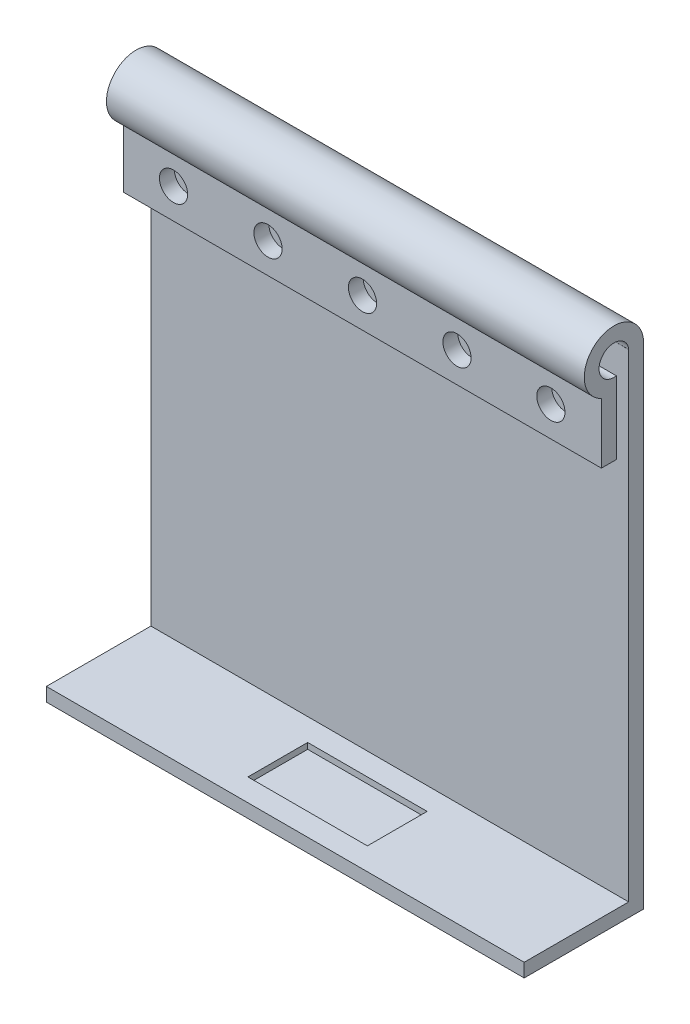
ISO-10303-21;
HEADER;
FILE_DESCRIPTION(('STEP AP214'),'2;1');
FILE_NAME('part.step','',(''),(''),'','','');
FILE_SCHEMA(('AUTOMOTIVE_DESIGN { 1 0 10303 214 1 1 1 1 }'));
ENDSEC;
DATA;
#1=APPLICATION_CONTEXT('core data for automotive mechanical design processes');
#2=APPLICATION_PROTOCOL_DEFINITION('international standard','automotive_design',2000,#1);
#3=PRODUCT_CONTEXT('',#1,'mechanical');
#4=PRODUCT('Part','Part','',(#3));
#5=PRODUCT_RELATED_PRODUCT_CATEGORY('part','',(#4));
#6=PRODUCT_DEFINITION_FORMATION('','',#4);
#7=PRODUCT_DEFINITION_CONTEXT('part definition',#1,'design');
#8=PRODUCT_DEFINITION('design','',#6,#7);
#9=PRODUCT_DEFINITION_SHAPE('','',#8);
#10=(LENGTH_UNIT() NAMED_UNIT(*) SI_UNIT(.MILLI.,.METRE.));
#11=(NAMED_UNIT(*) PLANE_ANGLE_UNIT() SI_UNIT($,.RADIAN.));
#12=(NAMED_UNIT(*) SI_UNIT($,.STERADIAN.) SOLID_ANGLE_UNIT());
#13=UNCERTAINTY_MEASURE_WITH_UNIT(LENGTH_MEASURE(1.E-05),#10,'distance_accuracy_value','');
#14=(GEOMETRIC_REPRESENTATION_CONTEXT(3) GLOBAL_UNCERTAINTY_ASSIGNED_CONTEXT((#13)) GLOBAL_UNIT_ASSIGNED_CONTEXT((#10,
#11,#12)) REPRESENTATION_CONTEXT('',''));
#15=CARTESIAN_POINT('',(0.,0.,0.));
#16=DIRECTION('',(0.,0.,1.));
#17=DIRECTION('',(1.,0.,0.));
#18=AXIS2_PLACEMENT_3D('',#15,#16,#17);
#19=CARTESIAN_POINT('',(0.,101.718969555035,3.175));
#20=DIRECTION('',(1.,0.,0.));
#21=DIRECTION('',(0.,0.,-1.));
#22=AXIS2_PLACEMENT_3D('',#19,#20,#21);
#23=PLANE('',#22);
#24=CARTESIAN_POINT('',(0.,101.334380732119,6.30719026611726));
#25=DIRECTION('',(1.,0.,0.));
#26=DIRECTION('',(0.,0.,-1.));
#27=AXIS2_PLACEMENT_3D('',#24,#25,#26);
#28=CIRCLE('',#27,3.175);
#29=CARTESIAN_POINT('',(0.,101.718969555035,3.15556902661396));
#30=VERTEX_POINT('',#29);
#31=CARTESIAN_POINT('',(0.,98.1999292876698,5.80138482685519));
#32=VERTEX_POINT('',#31);
#33=EDGE_CURVE('E304',#30,#32,#28,.T.);
#34=ORIENTED_EDGE('',*,*,#33,.T.);
#35=DIRECTION('',(0.,1.,0.));
#36=VECTOR('',#35,1.);
#37=CARTESIAN_POINT('',(0.,0.,5.80138482685519));
#38=LINE('',#37,#36);
#39=CARTESIAN_POINT('',(0.,82.7748742326806,5.80138482685519));
#40=VERTEX_POINT('',#39);
#41=EDGE_CURVE('E316',#40,#32,#38,.T.);
#42=ORIENTED_EDGE('',*,*,#41,.F.);
#43=DIRECTION('',(0.,0.,-1.));
#44=VECTOR('',#43,1.);
#45=CARTESIAN_POINT('',(0.,82.7748742326806,0.));
#46=LINE('',#45,#44);
#47=CARTESIAN_POINT('',(0.,82.7748742326806,8.97638482685518));
#48=VERTEX_POINT('',#47);
#49=EDGE_CURVE('E313',#48,#40,#46,.T.);
#50=ORIENTED_EDGE('',*,*,#49,.F.);
#51=DIRECTION('',(0.,-1.,0.));
#52=VECTOR('',#51,1.);
#53=CARTESIAN_POINT('',(0.,0.,8.97638482685518));
#54=LINE('',#53,#52);
#55=CARTESIAN_POINT('',(0.,95.6129273337618,8.97638482685518));
#56=VERTEX_POINT('',#55);
#57=EDGE_CURVE('E310',#56,#48,#54,.T.);
#58=ORIENTED_EDGE('',*,*,#57,.F.);
#59=CARTESIAN_POINT('',(0.,101.334380732119,6.30719026611726));
#60=DIRECTION('',(1.,0.,0.));
#61=DIRECTION('',(0.,0.,-1.));
#62=AXIS2_PLACEMENT_3D('',#59,#60,#61);
#63=CIRCLE('',#62,6.313448233149);
#64=CARTESIAN_POINT('',(0.,101.718969555035,0.00546668998822365));
#65=VERTEX_POINT('',#64);
#66=EDGE_CURVE('E307',#65,#56,#63,.T.);
#67=ORIENTED_EDGE('',*,*,#66,.F.);
#68=DIRECTION('',(0.,0.,-1.));
#69=VECTOR('',#68,1.);
#70=CARTESIAN_POINT('',(0.,101.718969555035,3.175));
#71=LINE('',#70,#69);
#72=CARTESIAN_POINT('',(0.,101.718969555035,0.));
#73=VERTEX_POINT('',#72);
#74=EDGE_CURVE('E386',#65,#73,#71,.T.);
#75=ORIENTED_EDGE('',*,*,#74,.T.);
#76=DIRECTION('',(0.,-1.,0.));
#77=VECTOR('',#76,1.);
#78=CARTESIAN_POINT('',(0.,101.718969555035,0.));
#79=LINE('',#78,#77);
#80=CARTESIAN_POINT('',(0.,101.615413718881,0.));
#81=VERTEX_POINT('',#80);
#82=EDGE_CURVE('E392',#73,#81,#79,.T.);
#83=ORIENTED_EDGE('',*,*,#82,.T.);
#84=CARTESIAN_POINT('',(0.,101.615413718881,0.));
#85=DIRECTION('',(0.,-1.,0.));
#86=VECTOR('',#85,1.);
#87=LINE('',#84,#86);
#88=CARTESIAN_POINT('',(0.,101.053347745358,0.));
#89=VERTEX_POINT('',#88);
#90=EDGE_CURVE('E396',#81,#89,#87,.T.);
#91=ORIENTED_EDGE('',*,*,#90,.T.);
#92=CARTESIAN_POINT('',(0.,-2.8971260585032,0.));
#93=VERTEX_POINT('',#92);
#94=EDGE_CURVE('E53',#89,#93,#79,.T.);
#95=ORIENTED_EDGE('',*,*,#94,.T.);
#96=DIRECTION('',(0.,0.,1.));
#97=VECTOR('',#96,1.);
#98=CARTESIAN_POINT('',(0.,-2.8971260585032,0.));
#99=LINE('',#98,#97);
#100=CARTESIAN_POINT('',(0.,-2.8971260585032,25.4));
#101=VERTEX_POINT('',#100);
#102=EDGE_CURVE('E229',#93,#101,#99,.T.);
#103=ORIENTED_EDGE('',*,*,#102,.T.);
#104=DIRECTION('',(0.,1.,0.));
#105=VECTOR('',#104,1.);
#106=CARTESIAN_POINT('',(0.,-2.8971260585032,25.4));
#107=LINE('',#106,#105);
#108=CARTESIAN_POINT('',(0.,0.,25.4));
#109=VERTEX_POINT('',#108);
#110=EDGE_CURVE('E220',#101,#109,#107,.T.);
#111=ORIENTED_EDGE('',*,*,#110,.T.);
#112=DIRECTION('',(0.,0.,-1.));
#113=VECTOR('',#112,1.);
#114=CARTESIAN_POINT('',(0.,0.,25.4));
#115=LINE('',#114,#113);
#116=CARTESIAN_POINT('',(0.,0.,3.175));
#117=VERTEX_POINT('',#116);
#118=EDGE_CURVE('E213',#109,#117,#115,.T.);
#119=ORIENTED_EDGE('',*,*,#118,.T.);
#120=DIRECTION('',(0.,-1.,0.));
#121=VECTOR('',#120,1.);
#122=CARTESIAN_POINT('',(0.,101.718969555035,3.175));
#123=LINE('',#122,#121);
#124=CARTESIAN_POINT('',(0.,101.718969555035,3.175));
#125=VERTEX_POINT('',#124);
#126=EDGE_CURVE('E371',#125,#117,#123,.T.);
#127=ORIENTED_EDGE('',*,*,#126,.F.);
#128=EDGE_CURVE('E461',#125,#30,#71,.T.);
#129=ORIENTED_EDGE('',*,*,#128,.T.);
#130=EDGE_LOOP('',(#34,#42,#50,#58,#67,#75,#83,#91,#95,#103,#111,#119,#127,#129));
#131=FACE_BOUND('',#130,.T.);
#132=ADVANCED_FACE('F49',(#131),#23,.F.);
#133=CARTESIAN_POINT('',(101.6,0.,3.175));
#134=DIRECTION('',(-1.,0.,0.));
#135=DIRECTION('',(0.,0.,1.));
#136=AXIS2_PLACEMENT_3D('',#133,#134,#135);
#137=PLANE('',#136);
#138=DIRECTION('',(0.,1.,0.));
#139=VECTOR('',#138,1.);
#140=CARTESIAN_POINT('',(101.6,0.,5.80138482685519));
#141=LINE('',#140,#139);
#142=CARTESIAN_POINT('',(101.6,82.7748742326806,5.80138482685519));
#143=VERTEX_POINT('',#142);
#144=CARTESIAN_POINT('',(101.6,98.1999292876698,5.80138482685519));
#145=VERTEX_POINT('',#144);
#146=EDGE_CURVE('E308',#143,#145,#141,.T.);
#147=ORIENTED_EDGE('',*,*,#146,.T.);
#148=CARTESIAN_POINT('',(101.6,101.334380732119,6.30719026611726));
#149=DIRECTION('',(1.,0.,0.));
#150=DIRECTION('',(0.,0.,-1.));
#151=AXIS2_PLACEMENT_3D('',#148,#149,#150);
#152=CIRCLE('',#151,3.175);
#153=CARTESIAN_POINT('',(101.6,101.718969555035,3.15556902661396));
#154=VERTEX_POINT('',#153);
#155=EDGE_CURVE('E303',#154,#145,#152,.T.);
#156=ORIENTED_EDGE('',*,*,#155,.F.);
#157=DIRECTION('',(0.,0.,-1.));
#158=VECTOR('',#157,1.);
#159=CARTESIAN_POINT('',(101.6,101.718969555035,3.175));
#160=LINE('',#159,#158);
#161=CARTESIAN_POINT('',(101.6,101.718969555035,3.175));
#162=VERTEX_POINT('',#161);
#163=EDGE_CURVE('E75',#162,#154,#160,.T.);
#164=ORIENTED_EDGE('',*,*,#163,.F.);
#165=DIRECTION('',(0.,1.,0.));
#166=VECTOR('',#165,1.);
#167=CARTESIAN_POINT('',(101.6,0.,3.175));
#168=LINE('',#167,#166);
#169=CARTESIAN_POINT('',(101.6,0.,3.175));
#170=VERTEX_POINT('',#169);
#171=EDGE_CURVE('E383',#170,#162,#168,.T.);
#172=ORIENTED_EDGE('',*,*,#171,.F.);
#173=DIRECTION('',(0.,0.,-1.));
#174=VECTOR('',#173,1.);
#175=CARTESIAN_POINT('',(101.6,0.,25.4));
#176=LINE('',#175,#174);
#177=CARTESIAN_POINT('',(101.6,0.,25.4));
#178=VERTEX_POINT('',#177);
#179=EDGE_CURVE('E217',#178,#170,#176,.T.);
#180=ORIENTED_EDGE('',*,*,#179,.F.);
#181=DIRECTION('',(0.,1.,0.));
#182=VECTOR('',#181,1.);
#183=CARTESIAN_POINT('',(101.6,-2.8971260585032,25.4));
#184=LINE('',#183,#182);
#185=CARTESIAN_POINT('',(101.6,-2.8971260585032,25.4));
#186=VERTEX_POINT('',#185);
#187=EDGE_CURVE('E223',#186,#178,#184,.T.);
#188=ORIENTED_EDGE('',*,*,#187,.F.);
#189=DIRECTION('',(0.,0.,1.));
#190=VECTOR('',#189,1.);
#191=CARTESIAN_POINT('',(101.6,-2.8971260585032,0.));
#192=LINE('',#191,#190);
#193=CARTESIAN_POINT('',(101.6,-2.8971260585032,0.));
#194=VERTEX_POINT('',#193);
#195=EDGE_CURVE('E219',#194,#186,#192,.T.);
#196=ORIENTED_EDGE('',*,*,#195,.F.);
#197=DIRECTION('',(0.,1.,0.));
#198=VECTOR('',#197,1.);
#199=CARTESIAN_POINT('',(101.6,0.,0.));
#200=LINE('',#199,#198);
#201=CARTESIAN_POINT('',(101.6,101.053347745358,0.));
#202=VERTEX_POINT('',#201);
#203=EDGE_CURVE('E413',#194,#202,#200,.T.);
#204=ORIENTED_EDGE('',*,*,#203,.T.);
#205=CARTESIAN_POINT('',(101.6,101.053347745358,0.));
#206=DIRECTION('',(0.,1.,0.));
#207=VECTOR('',#206,1.);
#208=LINE('',#205,#207);
#209=CARTESIAN_POINT('',(101.6,101.615413718881,0.));
#210=VERTEX_POINT('',#209);
#211=EDGE_CURVE('E344',#202,#210,#208,.T.);
#212=ORIENTED_EDGE('',*,*,#211,.T.);
#213=CARTESIAN_POINT('',(101.6,101.718969555035,0.));
#214=VERTEX_POINT('',#213);
#215=EDGE_CURVE('E395',#210,#214,#200,.T.);
#216=ORIENTED_EDGE('',*,*,#215,.T.);
#217=CARTESIAN_POINT('',(101.6,101.718969555035,0.00546668998822365));
#218=VERTEX_POINT('',#217);
#219=EDGE_CURVE('E480',#218,#214,#160,.T.);
#220=ORIENTED_EDGE('',*,*,#219,.F.);
#221=CARTESIAN_POINT('',(101.6,101.334380732119,6.30719026611726));
#222=DIRECTION('',(1.,0.,0.));
#223=DIRECTION('',(0.,0.,-1.));
#224=AXIS2_PLACEMENT_3D('',#221,#222,#223);
#225=CIRCLE('',#224,6.313448233149);
#226=CARTESIAN_POINT('',(101.6,95.6129273337618,8.97638482685518));
#227=VERTEX_POINT('',#226);
#228=EDGE_CURVE('E321',#218,#227,#225,.T.);
#229=ORIENTED_EDGE('',*,*,#228,.T.);
#230=DIRECTION('',(0.,-1.,0.));
#231=VECTOR('',#230,1.);
#232=CARTESIAN_POINT('',(101.6,0.,8.97638482685518));
#233=LINE('',#232,#231);
#234=CARTESIAN_POINT('',(101.6,82.7748742326806,8.97638482685518));
#235=VERTEX_POINT('',#234);
#236=EDGE_CURVE('E323',#227,#235,#233,.T.);
#237=ORIENTED_EDGE('',*,*,#236,.T.);
#238=DIRECTION('',(0.,0.,-1.));
#239=VECTOR('',#238,1.);
#240=CARTESIAN_POINT('',(101.6,82.7748742326806,0.));
#241=LINE('',#240,#239);
#242=EDGE_CURVE('E326',#235,#143,#241,.T.);
#243=ORIENTED_EDGE('',*,*,#242,.T.);
#244=EDGE_LOOP('',(#147,#156,#164,#172,#180,#188,#196,#204,#212,#216,#220,#229,#237,#243));
#245=FACE_BOUND('',#244,.T.);
#246=ADVANCED_FACE('F423',(#245),#137,.F.);
#247=CARTESIAN_POINT('',(0.,101.334380732119,6.30719026611726));
#248=DIRECTION('',(1.,0.,0.));
#249=DIRECTION('',(0.,0.,-1.));
#250=AXIS2_PLACEMENT_3D('',#247,#248,#249);
#251=CYLINDRICAL_SURFACE('',#250,3.175);
#252=DIRECTION('',(1.,0.,0.));
#253=VECTOR('',#252,1.);
#254=CARTESIAN_POINT('',(0.,98.1999292876698,5.80138482685519));
#255=LINE('',#254,#253);
#256=EDGE_CURVE('E300',#32,#145,#255,.T.);
#257=ORIENTED_EDGE('',*,*,#256,.F.);
#258=ORIENTED_EDGE('',*,*,#33,.F.);
#259=DIRECTION('',(1.,0.,0.));
#260=VECTOR('',#259,1.);
#261=CARTESIAN_POINT('',(0.,101.718969555035,3.15556902661396));
#262=LINE('',#261,#260);
#263=EDGE_CURVE('E339',#30,#154,#262,.T.);
#264=ORIENTED_EDGE('',*,*,#263,.T.);
#265=ORIENTED_EDGE('',*,*,#155,.T.);
#266=EDGE_LOOP('',(#257,#258,#264,#265));
#267=FACE_BOUND('',#266,.T.);
#268=ADVANCED_FACE('F365',(#267),#251,.F.);
#269=CARTESIAN_POINT('',(101.6,101.718969555035,3.175));
#270=DIRECTION('',(0.,-1.,0.));
#271=DIRECTION('',(0.,0.,-1.));
#272=AXIS2_PLACEMENT_3D('',#269,#270,#271);
#273=PLANE('',#272);
#274=ORIENTED_EDGE('',*,*,#263,.F.);
#275=ORIENTED_EDGE('',*,*,#128,.F.);
#276=DIRECTION('',(-1.,0.,0.));
#277=VECTOR('',#276,1.);
#278=CARTESIAN_POINT('',(101.6,101.718969555035,3.175));
#279=LINE('',#278,#277);
#280=EDGE_CURVE('E385',#162,#125,#279,.T.);
#281=ORIENTED_EDGE('',*,*,#280,.F.);
#282=ORIENTED_EDGE('',*,*,#163,.T.);
#283=EDGE_LOOP('',(#274,#275,#281,#282));
#284=FACE_BOUND('',#283,.T.);
#285=ADVANCED_FACE('F439',(#284),#273,.F.);
#286=CARTESIAN_POINT('',(0.,0.,0.));
#287=DIRECTION('',(0.,0.,1.));
#288=DIRECTION('',(1.,0.,0.));
#289=AXIS2_PLACEMENT_3D('',#286,#287,#288);
#290=PLANE('',#289);
#291=CARTESIAN_POINT('',(10.6180528519266,89.1939007832212,0.));
#292=DIRECTION('',(0.,0.,1.));
#293=DIRECTION('',(1.,0.,0.));
#294=AXIS2_PLACEMENT_3D('',#291,#292,#293);
#295=CIRCLE('',#294,3.);
#296=CARTESIAN_POINT('',(13.6180528519266,89.1939007832212,0.));
#297=VERTEX_POINT('',#296);
#298=EDGE_CURVE('E297',#297,#297,#295,.T.);
#299=ORIENTED_EDGE('',*,*,#298,.T.);
#300=EDGE_LOOP('',(#299));
#301=FACE_BOUND('',#300,.T.);
#302=CARTESIAN_POINT('',(50.8,89.1939007832212,0.));
#303=DIRECTION('',(0.,0.,1.));
#304=DIRECTION('',(1.,0.,0.));
#305=AXIS2_PLACEMENT_3D('',#302,#303,#304);
#306=CIRCLE('',#305,3.);
#307=CARTESIAN_POINT('',(53.8,89.1939007832212,0.));
#308=VERTEX_POINT('',#307);
#309=EDGE_CURVE('E288',#308,#308,#306,.T.);
#310=ORIENTED_EDGE('',*,*,#309,.T.);
#311=EDGE_LOOP('',(#310));
#312=FACE_BOUND('',#311,.T.);
#313=CARTESIAN_POINT('',(90.8563696876377,89.1939007832212,0.));
#314=DIRECTION('',(0.,0.,1.));
#315=DIRECTION('',(1.,0.,0.));
#316=AXIS2_PLACEMENT_3D('',#313,#314,#315);
#317=CIRCLE('',#316,3.00000000000001);
#318=CARTESIAN_POINT('',(93.8563696876377,89.1939007832212,0.));
#319=VERTEX_POINT('',#318);
#320=EDGE_CURVE('E279',#319,#319,#317,.T.);
#321=ORIENTED_EDGE('',*,*,#320,.T.);
#322=EDGE_LOOP('',(#321));
#323=FACE_BOUND('',#322,.T.);
#324=CARTESIAN_POINT('',(70.8909735740367,89.1939007832212,0.));
#325=DIRECTION('',(0.,0.,1.));
#326=DIRECTION('',(1.,0.,0.));
#327=AXIS2_PLACEMENT_3D('',#324,#325,#326);
#328=CIRCLE('',#327,3.00000000000001);
#329=CARTESIAN_POINT('',(73.8909735740367,89.1939007832212,0.));
#330=VERTEX_POINT('',#329);
#331=EDGE_CURVE('E270',#330,#330,#328,.T.);
#332=ORIENTED_EDGE('',*,*,#331,.T.);
#333=EDGE_LOOP('',(#332));
#334=FACE_BOUND('',#333,.T.);
#335=CARTESIAN_POINT('',(30.7090264259633,89.1939007832212,0.));
#336=DIRECTION('',(0.,0.,1.));
#337=DIRECTION('',(1.,0.,0.));
#338=AXIS2_PLACEMENT_3D('',#335,#336,#337);
#339=CIRCLE('',#338,3.);
#340=CARTESIAN_POINT('',(33.7090264259633,89.1939007832212,0.));
#341=VERTEX_POINT('',#340);
#342=EDGE_CURVE('E261',#341,#341,#339,.T.);
#343=ORIENTED_EDGE('',*,*,#342,.T.);
#344=EDGE_LOOP('',(#343));
#345=FACE_BOUND('',#344,.T.);
#346=ORIENTED_EDGE('',*,*,#94,.F.);
#347=DIRECTION('',(1.,0.,0.));
#348=VECTOR('',#347,1.);
#349=CARTESIAN_POINT('',(0.,101.053347745358,0.));
#350=LINE('',#349,#348);
#351=EDGE_CURVE('E11',#89,#202,#350,.T.);
#352=ORIENTED_EDGE('',*,*,#351,.T.);
#353=ORIENTED_EDGE('',*,*,#203,.F.);
#354=DIRECTION('',(-1.,0.,0.));
#355=VECTOR('',#354,1.);
#356=CARTESIAN_POINT('',(101.6,-2.8971260585032,0.));
#357=LINE('',#356,#355);
#358=EDGE_CURVE('E226',#194,#93,#357,.T.);
#359=ORIENTED_EDGE('',*,*,#358,.T.);
#360=EDGE_LOOP('',(#346,#352,#353,#359));
#361=FACE_BOUND('',#360,.T.);
#362=ADVANCED_FACE('F437',(#301,#312,#323,#334,#345,#361),#290,.F.);
#363=ORIENTED_EDGE('',*,*,#74,.F.);
#364=DIRECTION('',(1.,0.,0.));
#365=VECTOR('',#364,1.);
#366=CARTESIAN_POINT('',(0.,101.718969555035,0.00546668998822365));
#367=LINE('',#366,#365);
#368=EDGE_CURVE('E332',#65,#218,#367,.T.);
#369=ORIENTED_EDGE('',*,*,#368,.T.);
#370=ORIENTED_EDGE('',*,*,#219,.T.);
#371=DIRECTION('',(-1.,0.,0.));
#372=VECTOR('',#371,1.);
#373=CARTESIAN_POINT('',(101.6,101.718969555035,0.));
#374=LINE('',#373,#372);
#375=EDGE_CURVE('E380',#214,#73,#374,.T.);
#376=ORIENTED_EDGE('',*,*,#375,.T.);
#377=EDGE_LOOP('',(#363,#369,#370,#376));
#378=FACE_BOUND('',#377,.T.);
#379=ADVANCED_FACE('F433',(#378),#273,.F.);
#380=CARTESIAN_POINT('',(0.,0.,3.175));
#381=DIRECTION('',(0.,0.,1.));
#382=DIRECTION('',(1.,0.,0.));
#383=AXIS2_PLACEMENT_3D('',#380,#381,#382);
#384=PLANE('',#383);
#385=CARTESIAN_POINT('',(10.6180528519266,89.1939007832212,3.175));
#386=DIRECTION('',(0.,0.,1.));
#387=DIRECTION('',(1.,0.,0.));
#388=AXIS2_PLACEMENT_3D('',#385,#386,#387);
#389=CIRCLE('',#388,3.);
#390=CARTESIAN_POINT('',(13.6180528519266,89.1939007832212,3.175));
#391=VERTEX_POINT('',#390);
#392=EDGE_CURVE('E294',#391,#391,#389,.T.);
#393=ORIENTED_EDGE('',*,*,#392,.F.);
#394=EDGE_LOOP('',(#393));
#395=FACE_BOUND('',#394,.T.);
#396=CARTESIAN_POINT('',(50.8,89.1939007832212,3.175));
#397=DIRECTION('',(0.,0.,1.));
#398=DIRECTION('',(1.,0.,0.));
#399=AXIS2_PLACEMENT_3D('',#396,#397,#398);
#400=CIRCLE('',#399,3.);
#401=CARTESIAN_POINT('',(53.8,89.1939007832212,3.175));
#402=VERTEX_POINT('',#401);
#403=EDGE_CURVE('E285',#402,#402,#400,.T.);
#404=ORIENTED_EDGE('',*,*,#403,.F.);
#405=EDGE_LOOP('',(#404));
#406=FACE_BOUND('',#405,.T.);
#407=CARTESIAN_POINT('',(90.8563696876377,89.1939007832212,3.175));
#408=DIRECTION('',(0.,0.,1.));
#409=DIRECTION('',(1.,0.,0.));
#410=AXIS2_PLACEMENT_3D('',#407,#408,#409);
#411=CIRCLE('',#410,3.00000000000001);
#412=CARTESIAN_POINT('',(93.8563696876377,89.1939007832212,3.175));
#413=VERTEX_POINT('',#412);
#414=EDGE_CURVE('E276',#413,#413,#411,.T.);
#415=ORIENTED_EDGE('',*,*,#414,.F.);
#416=EDGE_LOOP('',(#415));
#417=FACE_BOUND('',#416,.T.);
#418=CARTESIAN_POINT('',(70.8909735740367,89.1939007832212,3.175));
#419=DIRECTION('',(0.,0.,1.));
#420=DIRECTION('',(1.,0.,0.));
#421=AXIS2_PLACEMENT_3D('',#418,#419,#420);
#422=CIRCLE('',#421,3.00000000000001);
#423=CARTESIAN_POINT('',(73.8909735740367,89.1939007832212,3.175));
#424=VERTEX_POINT('',#423);
#425=EDGE_CURVE('E267',#424,#424,#422,.T.);
#426=ORIENTED_EDGE('',*,*,#425,.F.);
#427=EDGE_LOOP('',(#426));
#428=FACE_BOUND('',#427,.T.);
#429=CARTESIAN_POINT('',(30.7090264259633,89.1939007832212,3.175));
#430=DIRECTION('',(0.,0.,1.));
#431=DIRECTION('',(1.,0.,0.));
#432=AXIS2_PLACEMENT_3D('',#429,#430,#431);
#433=CIRCLE('',#432,3.);
#434=CARTESIAN_POINT('',(33.7090264259633,89.1939007832212,3.175));
#435=VERTEX_POINT('',#434);
#436=EDGE_CURVE('E258',#435,#435,#433,.T.);
#437=ORIENTED_EDGE('',*,*,#436,.F.);
#438=EDGE_LOOP('',(#437));
#439=FACE_BOUND('',#438,.T.);
#440=ORIENTED_EDGE('',*,*,#171,.T.);
#441=ORIENTED_EDGE('',*,*,#280,.T.);
#442=ORIENTED_EDGE('',*,*,#126,.T.);
#443=DIRECTION('',(1.,0.,0.));
#444=VECTOR('',#443,1.);
#445=CARTESIAN_POINT('',(0.,0.,3.175));
#446=LINE('',#445,#444);
#447=EDGE_CURVE('E379',#117,#170,#446,.T.);
#448=ORIENTED_EDGE('',*,*,#447,.T.);
#449=EDGE_LOOP('',(#440,#441,#442,#448));
#450=FACE_BOUND('',#449,.T.);
#451=ADVANCED_FACE('F436',(#395,#406,#417,#428,#439,#450),#384,.T.);
#452=ORIENTED_EDGE('',*,*,#215,.F.);
#453=DIRECTION('',(1.,0.,0.));
#454=VECTOR('',#453,1.);
#455=CARTESIAN_POINT('',(0.,101.615413718881,0.));
#456=LINE('',#455,#454);
#457=EDGE_CURVE('E59',#210,#81,#456,.F.);
#458=ORIENTED_EDGE('',*,*,#457,.T.);
#459=ORIENTED_EDGE('',*,*,#82,.F.);
#460=ORIENTED_EDGE('',*,*,#375,.F.);
#461=EDGE_LOOP('',(#452,#458,#459,#460));
#462=FACE_BOUND('',#461,.T.);
#463=ADVANCED_FACE('F440',(#462),#290,.F.);
#464=CARTESIAN_POINT('',(0.,101.334380732119,6.30719026611726));
#465=DIRECTION('',(1.,0.,0.));
#466=DIRECTION('',(0.,0.,-1.));
#467=AXIS2_PLACEMENT_3D('',#464,#465,#466);
#468=CYLINDRICAL_SURFACE('',#467,6.313448233149);
#469=ORIENTED_EDGE('',*,*,#351,.F.);
#470=ORIENTED_EDGE('',*,*,#90,.F.);
#471=ORIENTED_EDGE('',*,*,#457,.F.);
#472=ORIENTED_EDGE('',*,*,#211,.F.);
#473=EDGE_LOOP('',(#469,#470,#471,#472));
#474=FACE_BOUND('',#473,.T.);
#475=ADVANCED_FACE('F361',(#474),#468,.T.);
#476=ORIENTED_EDGE('',*,*,#368,.F.);
#477=ORIENTED_EDGE('',*,*,#66,.T.);
#478=DIRECTION('',(1.,0.,0.));
#479=VECTOR('',#478,1.);
#480=CARTESIAN_POINT('',(0.,95.6129273337618,8.97638482685518));
#481=LINE('',#480,#479);
#482=EDGE_CURVE('E318',#56,#227,#481,.T.);
#483=ORIENTED_EDGE('',*,*,#482,.T.);
#484=ORIENTED_EDGE('',*,*,#228,.F.);
#485=EDGE_LOOP('',(#476,#477,#483,#484));
#486=FACE_BOUND('',#485,.T.);
#487=ADVANCED_FACE('F350',(#486),#468,.T.);
#488=CARTESIAN_POINT('',(0.,0.,5.80138482685519));
#489=DIRECTION('',(0.,0.,-1.));
#490=DIRECTION('',(-1.,0.,0.));
#491=AXIS2_PLACEMENT_3D('',#488,#489,#490);
#492=PLANE('',#491);
#493=CARTESIAN_POINT('',(10.6180528519266,89.1939007832212,5.80138482685519));
#494=DIRECTION('',(0.,0.,-1.));
#495=DIRECTION('',(-1.,0.,0.));
#496=AXIS2_PLACEMENT_3D('',#493,#494,#495);
#497=CIRCLE('',#496,3.);
#498=CARTESIAN_POINT('',(7.61805285192657,89.1939007832212,5.80138482685519));
#499=VERTEX_POINT('',#498);
#500=EDGE_CURVE('E291',#499,#499,#497,.T.);
#501=ORIENTED_EDGE('',*,*,#500,.F.);
#502=EDGE_LOOP('',(#501));
#503=FACE_BOUND('',#502,.T.);
#504=CARTESIAN_POINT('',(50.8,89.1939007832212,5.80138482685519));
#505=DIRECTION('',(0.,0.,-1.));
#506=DIRECTION('',(-1.,0.,0.));
#507=AXIS2_PLACEMENT_3D('',#504,#505,#506);
#508=CIRCLE('',#507,3.);
#509=CARTESIAN_POINT('',(47.8,89.1939007832212,5.80138482685519));
#510=VERTEX_POINT('',#509);
#511=EDGE_CURVE('E282',#510,#510,#508,.T.);
#512=ORIENTED_EDGE('',*,*,#511,.F.);
#513=EDGE_LOOP('',(#512));
#514=FACE_BOUND('',#513,.T.);
#515=CARTESIAN_POINT('',(90.8563696876377,89.1939007832212,5.80138482685519));
#516=DIRECTION('',(0.,0.,-1.));
#517=DIRECTION('',(-1.,0.,0.));
#518=AXIS2_PLACEMENT_3D('',#515,#516,#517);
#519=CIRCLE('',#518,3.00000000000001);
#520=CARTESIAN_POINT('',(87.8563696876377,89.1939007832212,5.80138482685519));
#521=VERTEX_POINT('',#520);
#522=EDGE_CURVE('E273',#521,#521,#519,.T.);
#523=ORIENTED_EDGE('',*,*,#522,.F.);
#524=EDGE_LOOP('',(#523));
#525=FACE_BOUND('',#524,.T.);
#526=CARTESIAN_POINT('',(70.8909735740367,89.1939007832212,5.80138482685519));
#527=DIRECTION('',(0.,0.,-1.));
#528=DIRECTION('',(-1.,0.,0.));
#529=AXIS2_PLACEMENT_3D('',#526,#527,#528);
#530=CIRCLE('',#529,3.00000000000001);
#531=CARTESIAN_POINT('',(67.8909735740367,89.1939007832212,5.80138482685519));
#532=VERTEX_POINT('',#531);
#533=EDGE_CURVE('E264',#532,#532,#530,.T.);
#534=ORIENTED_EDGE('',*,*,#533,.F.);
#535=EDGE_LOOP('',(#534));
#536=FACE_BOUND('',#535,.T.);
#537=CARTESIAN_POINT('',(30.7090264259633,89.1939007832212,5.80138482685519));
#538=DIRECTION('',(0.,0.,-1.));
#539=DIRECTION('',(-1.,0.,0.));
#540=AXIS2_PLACEMENT_3D('',#537,#538,#539);
#541=CIRCLE('',#540,3.);
#542=CARTESIAN_POINT('',(27.7090264259633,89.1939007832212,5.80138482685519));
#543=VERTEX_POINT('',#542);
#544=EDGE_CURVE('E244',#543,#543,#541,.T.);
#545=ORIENTED_EDGE('',*,*,#544,.F.);
#546=EDGE_LOOP('',(#545));
#547=FACE_BOUND('',#546,.T.);
#548=ORIENTED_EDGE('',*,*,#146,.F.);
#549=DIRECTION('',(1.,0.,0.));
#550=VECTOR('',#549,1.);
#551=CARTESIAN_POINT('',(0.,82.7748742326806,5.80138482685519));
#552=LINE('',#551,#550);
#553=EDGE_CURVE('E330',#40,#143,#552,.T.);
#554=ORIENTED_EDGE('',*,*,#553,.F.);
#555=ORIENTED_EDGE('',*,*,#41,.T.);
#556=ORIENTED_EDGE('',*,*,#256,.T.);
#557=EDGE_LOOP('',(#548,#554,#555,#556));
#558=FACE_BOUND('',#557,.T.);
#559=ADVANCED_FACE('F360',(#503,#514,#525,#536,#547,#558),#492,.T.);
#560=CARTESIAN_POINT('',(0.,82.7748742326806,0.));
#561=DIRECTION('',(0.,-1.,0.));
#562=DIRECTION('',(0.,0.,-1.));
#563=AXIS2_PLACEMENT_3D('',#560,#561,#562);
#564=PLANE('',#563);
#565=ORIENTED_EDGE('',*,*,#242,.F.);
#566=DIRECTION('',(1.,0.,0.));
#567=VECTOR('',#566,1.);
#568=CARTESIAN_POINT('',(0.,82.7748742326806,8.97638482685518));
#569=LINE('',#568,#567);
#570=EDGE_CURVE('E333',#48,#235,#569,.T.);
#571=ORIENTED_EDGE('',*,*,#570,.F.);
#572=ORIENTED_EDGE('',*,*,#49,.T.);
#573=ORIENTED_EDGE('',*,*,#553,.T.);
#574=EDGE_LOOP('',(#565,#571,#572,#573));
#575=FACE_BOUND('',#574,.T.);
#576=ADVANCED_FACE('F469',(#575),#564,.T.);
#577=CARTESIAN_POINT('',(0.,0.,8.97638482685518));
#578=DIRECTION('',(0.,0.,1.));
#579=DIRECTION('',(1.,0.,0.));
#580=AXIS2_PLACEMENT_3D('',#577,#578,#579);
#581=PLANE('',#580);
#582=CARTESIAN_POINT('',(10.6180528519266,89.1939007832212,8.97638482685518));
#583=DIRECTION('',(0.,0.,1.));
#584=DIRECTION('',(1.,0.,0.));
#585=AXIS2_PLACEMENT_3D('',#582,#583,#584);
#586=CIRCLE('',#585,3.);
#587=CARTESIAN_POINT('',(13.6180528519266,89.1939007832212,8.97638482685518));
#588=VERTEX_POINT('',#587);
#589=EDGE_CURVE('E241',#588,#588,#586,.T.);
#590=ORIENTED_EDGE('',*,*,#589,.F.);
#591=EDGE_LOOP('',(#590));
#592=FACE_BOUND('',#591,.T.);
#593=CARTESIAN_POINT('',(50.8,89.1939007832212,8.97638482685518));
#594=DIRECTION('',(0.,0.,1.));
#595=DIRECTION('',(1.,0.,0.));
#596=AXIS2_PLACEMENT_3D('',#593,#594,#595);
#597=CIRCLE('',#596,3.);
#598=CARTESIAN_POINT('',(53.8,89.1939007832212,8.97638482685518));
#599=VERTEX_POINT('',#598);
#600=EDGE_CURVE('E236',#599,#599,#597,.T.);
#601=ORIENTED_EDGE('',*,*,#600,.F.);
#602=EDGE_LOOP('',(#601));
#603=FACE_BOUND('',#602,.T.);
#604=CARTESIAN_POINT('',(90.8563696876377,89.1939007832212,8.97638482685518));
#605=DIRECTION('',(0.,0.,1.));
#606=DIRECTION('',(1.,0.,0.));
#607=AXIS2_PLACEMENT_3D('',#604,#605,#606);
#608=CIRCLE('',#607,3.00000000000001);
#609=CARTESIAN_POINT('',(93.8563696876377,89.1939007832212,8.97638482685518));
#610=VERTEX_POINT('',#609);
#611=EDGE_CURVE('E246',#610,#610,#608,.T.);
#612=ORIENTED_EDGE('',*,*,#611,.F.);
#613=EDGE_LOOP('',(#612));
#614=FACE_BOUND('',#613,.T.);
#615=CARTESIAN_POINT('',(70.8909735740367,89.1939007832212,8.97638482685518));
#616=DIRECTION('',(0.,0.,1.));
#617=DIRECTION('',(1.,0.,0.));
#618=AXIS2_PLACEMENT_3D('',#615,#616,#617);
#619=CIRCLE('',#618,3.00000000000001);
#620=CARTESIAN_POINT('',(73.8909735740367,89.1939007832212,8.97638482685518));
#621=VERTEX_POINT('',#620);
#622=EDGE_CURVE('E249',#621,#621,#619,.T.);
#623=ORIENTED_EDGE('',*,*,#622,.F.);
#624=EDGE_LOOP('',(#623));
#625=FACE_BOUND('',#624,.T.);
#626=CARTESIAN_POINT('',(30.7090264259633,89.1939007832212,8.97638482685518));
#627=DIRECTION('',(0.,0.,1.));
#628=DIRECTION('',(1.,0.,0.));
#629=AXIS2_PLACEMENT_3D('',#626,#627,#628);
#630=CIRCLE('',#629,3.);
#631=CARTESIAN_POINT('',(33.7090264259633,89.1939007832212,8.97638482685518));
#632=VERTEX_POINT('',#631);
#633=EDGE_CURVE('E245',#632,#632,#630,.T.);
#634=ORIENTED_EDGE('',*,*,#633,.F.);
#635=EDGE_LOOP('',(#634));
#636=FACE_BOUND('',#635,.T.);
#637=ORIENTED_EDGE('',*,*,#236,.F.);
#638=ORIENTED_EDGE('',*,*,#482,.F.);
#639=ORIENTED_EDGE('',*,*,#57,.T.);
#640=ORIENTED_EDGE('',*,*,#570,.T.);
#641=EDGE_LOOP('',(#637,#638,#639,#640));
#642=FACE_BOUND('',#641,.T.);
#643=ADVANCED_FACE('F363',(#592,#603,#614,#625,#636,#642),#581,.T.);
#644=CARTESIAN_POINT('',(30.7090264259633,89.1939007832212,-1.81861517314481));
#645=DIRECTION('',(0.,0.,1.));
#646=DIRECTION('',(1.,0.,0.));
#647=AXIS2_PLACEMENT_3D('',#644,#645,#646);
#648=CYLINDRICAL_SURFACE('',#647,3.);
#649=ORIENTED_EDGE('',*,*,#544,.T.);
#650=EDGE_LOOP('',(#649));
#651=FACE_BOUND('',#650,.T.);
#652=ORIENTED_EDGE('',*,*,#633,.T.);
#653=EDGE_LOOP('',(#652));
#654=FACE_BOUND('',#653,.T.);
#655=ADVANCED_FACE('F525',(#651,#654),#648,.F.);
#656=CARTESIAN_POINT('',(70.8909735740367,89.1939007832212,-1.81861517314481));
#657=DIRECTION('',(0.,0.,1.));
#658=DIRECTION('',(1.,0.,0.));
#659=AXIS2_PLACEMENT_3D('',#656,#657,#658);
#660=CYLINDRICAL_SURFACE('',#659,3.00000000000001);
#661=ORIENTED_EDGE('',*,*,#533,.T.);
#662=EDGE_LOOP('',(#661));
#663=FACE_BOUND('',#662,.T.);
#664=ORIENTED_EDGE('',*,*,#622,.T.);
#665=EDGE_LOOP('',(#664));
#666=FACE_BOUND('',#665,.T.);
#667=ADVANCED_FACE('F531',(#663,#666),#660,.F.);
#668=CARTESIAN_POINT('',(90.8563696876377,89.1939007832212,-1.81861517314481));
#669=DIRECTION('',(0.,0.,1.));
#670=DIRECTION('',(1.,0.,0.));
#671=AXIS2_PLACEMENT_3D('',#668,#669,#670);
#672=CYLINDRICAL_SURFACE('',#671,3.00000000000001);
#673=ORIENTED_EDGE('',*,*,#522,.T.);
#674=EDGE_LOOP('',(#673));
#675=FACE_BOUND('',#674,.T.);
#676=ORIENTED_EDGE('',*,*,#611,.T.);
#677=EDGE_LOOP('',(#676));
#678=FACE_BOUND('',#677,.T.);
#679=ADVANCED_FACE('F541',(#675,#678),#672,.F.);
#680=CARTESIAN_POINT('',(50.8,89.1939007832212,-1.81861517314481));
#681=DIRECTION('',(0.,0.,1.));
#682=DIRECTION('',(1.,0.,0.));
#683=AXIS2_PLACEMENT_3D('',#680,#681,#682);
#684=CYLINDRICAL_SURFACE('',#683,3.);
#685=ORIENTED_EDGE('',*,*,#511,.T.);
#686=EDGE_LOOP('',(#685));
#687=FACE_BOUND('',#686,.T.);
#688=ORIENTED_EDGE('',*,*,#600,.T.);
#689=EDGE_LOOP('',(#688));
#690=FACE_BOUND('',#689,.T.);
#691=ADVANCED_FACE('F551',(#687,#690),#684,.F.);
#692=CARTESIAN_POINT('',(10.6180528519266,89.1939007832212,-1.81861517314481));
#693=DIRECTION('',(0.,0.,1.));
#694=DIRECTION('',(1.,0.,0.));
#695=AXIS2_PLACEMENT_3D('',#692,#693,#694);
#696=CYLINDRICAL_SURFACE('',#695,3.);
#697=ORIENTED_EDGE('',*,*,#500,.T.);
#698=EDGE_LOOP('',(#697));
#699=FACE_BOUND('',#698,.T.);
#700=ORIENTED_EDGE('',*,*,#589,.T.);
#701=EDGE_LOOP('',(#700));
#702=FACE_BOUND('',#701,.T.);
#703=ADVANCED_FACE('F561',(#699,#702),#696,.F.);
#704=ORIENTED_EDGE('',*,*,#436,.T.);
#705=EDGE_LOOP('',(#704));
#706=FACE_BOUND('',#705,.T.);
#707=ORIENTED_EDGE('',*,*,#342,.F.);
#708=EDGE_LOOP('',(#707));
#709=FACE_BOUND('',#708,.T.);
#710=ADVANCED_FACE('F534',(#706,#709),#648,.F.);
#711=ORIENTED_EDGE('',*,*,#425,.T.);
#712=EDGE_LOOP('',(#711));
#713=FACE_BOUND('',#712,.T.);
#714=ORIENTED_EDGE('',*,*,#331,.F.);
#715=EDGE_LOOP('',(#714));
#716=FACE_BOUND('',#715,.T.);
#717=ADVANCED_FACE('F544',(#713,#716),#660,.F.);
#718=ORIENTED_EDGE('',*,*,#414,.T.);
#719=EDGE_LOOP('',(#718));
#720=FACE_BOUND('',#719,.T.);
#721=ORIENTED_EDGE('',*,*,#320,.F.);
#722=EDGE_LOOP('',(#721));
#723=FACE_BOUND('',#722,.T.);
#724=ADVANCED_FACE('F554',(#720,#723),#672,.F.);
#725=ORIENTED_EDGE('',*,*,#403,.T.);
#726=EDGE_LOOP('',(#725));
#727=FACE_BOUND('',#726,.T.);
#728=ORIENTED_EDGE('',*,*,#309,.F.);
#729=EDGE_LOOP('',(#728));
#730=FACE_BOUND('',#729,.T.);
#731=ADVANCED_FACE('F564',(#727,#730),#684,.F.);
#732=ORIENTED_EDGE('',*,*,#392,.T.);
#733=EDGE_LOOP('',(#732));
#734=FACE_BOUND('',#733,.T.);
#735=ORIENTED_EDGE('',*,*,#298,.F.);
#736=EDGE_LOOP('',(#735));
#737=FACE_BOUND('',#736,.T.);
#738=ADVANCED_FACE('F573',(#734,#737),#696,.F.);
#739=CARTESIAN_POINT('',(101.6,0.,25.4));
#740=DIRECTION('',(0.,1.,0.));
#741=DIRECTION('',(0.,0.,1.));
#742=AXIS2_PLACEMENT_3D('',#739,#740,#741);
#743=PLANE('',#742);
#744=DIRECTION('',(0.,0.,1.));
#745=VECTOR('',#744,1.);
#746=CARTESIAN_POINT('',(38.1,0.,20.6375));
#747=LINE('',#746,#745);
#748=CARTESIAN_POINT('',(38.1,0.,7.93750000000001));
#749=VERTEX_POINT('',#748);
#750=CARTESIAN_POINT('',(38.1,0.,20.6375));
#751=VERTEX_POINT('',#750);
#752=EDGE_CURVE('E67',#749,#751,#747,.T.);
#753=ORIENTED_EDGE('',*,*,#752,.F.);
#754=DIRECTION('',(-1.,0.,0.));
#755=VECTOR('',#754,1.);
#756=CARTESIAN_POINT('',(63.5,0.,7.9375));
#757=LINE('',#756,#755);
#758=CARTESIAN_POINT('',(63.5,0.,7.9375));
#759=VERTEX_POINT('',#758);
#760=EDGE_CURVE('E198',#759,#749,#757,.T.);
#761=ORIENTED_EDGE('',*,*,#760,.F.);
#762=DIRECTION('',(0.,0.,-1.));
#763=VECTOR('',#762,1.);
#764=CARTESIAN_POINT('',(63.5,0.,20.6375));
#765=LINE('',#764,#763);
#766=CARTESIAN_POINT('',(63.5,0.,20.6375));
#767=VERTEX_POINT('',#766);
#768=EDGE_CURVE('E201',#767,#759,#765,.T.);
#769=ORIENTED_EDGE('',*,*,#768,.F.);
#770=DIRECTION('',(1.,0.,0.));
#771=VECTOR('',#770,1.);
#772=CARTESIAN_POINT('',(63.5,0.,20.6375));
#773=LINE('',#772,#771);
#774=EDGE_CURVE('E207',#751,#767,#773,.T.);
#775=ORIENTED_EDGE('',*,*,#774,.F.);
#776=EDGE_LOOP('',(#753,#761,#769,#775));
#777=FACE_BOUND('',#776,.T.);
#778=ORIENTED_EDGE('',*,*,#447,.F.);
#779=ORIENTED_EDGE('',*,*,#118,.F.);
#780=DIRECTION('',(-1.,0.,0.));
#781=VECTOR('',#780,1.);
#782=CARTESIAN_POINT('',(101.6,0.,25.4));
#783=LINE('',#782,#781);
#784=EDGE_CURVE('E234',#178,#109,#783,.T.);
#785=ORIENTED_EDGE('',*,*,#784,.F.);
#786=ORIENTED_EDGE('',*,*,#179,.T.);
#787=EDGE_LOOP('',(#778,#779,#785,#786));
#788=FACE_BOUND('',#787,.T.);
#789=ADVANCED_FACE('F606',(#777,#788),#743,.T.);
#790=CARTESIAN_POINT('',(101.6,-2.8971260585032,25.4));
#791=DIRECTION('',(0.,0.,1.));
#792=DIRECTION('',(1.,0.,0.));
#793=AXIS2_PLACEMENT_3D('',#790,#791,#792);
#794=PLANE('',#793);
#795=ORIENTED_EDGE('',*,*,#110,.F.);
#796=DIRECTION('',(-1.,0.,0.));
#797=VECTOR('',#796,1.);
#798=CARTESIAN_POINT('',(101.6,-2.8971260585032,25.4));
#799=LINE('',#798,#797);
#800=EDGE_CURVE('E237',#186,#101,#799,.T.);
#801=ORIENTED_EDGE('',*,*,#800,.F.);
#802=ORIENTED_EDGE('',*,*,#187,.T.);
#803=ORIENTED_EDGE('',*,*,#784,.T.);
#804=EDGE_LOOP('',(#795,#801,#802,#803));
#805=FACE_BOUND('',#804,.T.);
#806=ADVANCED_FACE('F493',(#805),#794,.T.);
#807=CARTESIAN_POINT('',(101.6,-2.8971260585032,0.));
#808=DIRECTION('',(0.,-1.,0.));
#809=DIRECTION('',(0.,0.,-1.));
#810=AXIS2_PLACEMENT_3D('',#807,#808,#809);
#811=PLANE('',#810);
#812=ORIENTED_EDGE('',*,*,#102,.F.);
#813=ORIENTED_EDGE('',*,*,#358,.F.);
#814=ORIENTED_EDGE('',*,*,#195,.T.);
#815=ORIENTED_EDGE('',*,*,#800,.T.);
#816=EDGE_LOOP('',(#812,#813,#814,#815));
#817=FACE_BOUND('',#816,.T.);
#818=ADVANCED_FACE('F490',(#817),#811,.T.);
#819=CARTESIAN_POINT('',(38.1,-1.27,20.6375));
#820=DIRECTION('',(-1.,0.,0.));
#821=DIRECTION('',(0.,0.,1.));
#822=AXIS2_PLACEMENT_3D('',#819,#820,#821);
#823=PLANE('',#822);
#824=ORIENTED_EDGE('',*,*,#752,.T.);
#825=DIRECTION('',(0.,1.,0.));
#826=VECTOR('',#825,1.);
#827=CARTESIAN_POINT('',(38.1,-1.27,20.6375));
#828=LINE('',#827,#826);
#829=CARTESIAN_POINT('',(38.1,-1.27,20.6375));
#830=VERTEX_POINT('',#829);
#831=EDGE_CURVE('E176',#830,#751,#828,.T.);
#832=ORIENTED_EDGE('',*,*,#831,.F.);
#833=DIRECTION('',(0.,0.,1.));
#834=VECTOR('',#833,1.);
#835=CARTESIAN_POINT('',(38.1,-1.27,20.6375));
#836=LINE('',#835,#834);
#837=CARTESIAN_POINT('',(38.1,-1.27,7.93750000000001));
#838=VERTEX_POINT('',#837);
#839=EDGE_CURVE('E180',#838,#830,#836,.T.);
#840=ORIENTED_EDGE('',*,*,#839,.F.);
#841=DIRECTION('',(0.,1.,0.));
#842=VECTOR('',#841,1.);
#843=CARTESIAN_POINT('',(38.1,-1.27,7.93750000000001));
#844=LINE('',#843,#842);
#845=EDGE_CURVE('E211',#838,#749,#844,.T.);
#846=ORIENTED_EDGE('',*,*,#845,.T.);
#847=EDGE_LOOP('',(#824,#832,#840,#846));
#848=FACE_BOUND('',#847,.T.);
#849=ADVANCED_FACE('F178',(#848),#823,.F.);
#850=CARTESIAN_POINT('',(63.5,-1.27,7.9375));
#851=DIRECTION('',(0.,0.,-1.));
#852=DIRECTION('',(-1.,0.,0.));
#853=AXIS2_PLACEMENT_3D('',#850,#851,#852);
#854=PLANE('',#853);
#855=ORIENTED_EDGE('',*,*,#760,.T.);
#856=ORIENTED_EDGE('',*,*,#845,.F.);
#857=DIRECTION('',(-1.,0.,0.));
#858=VECTOR('',#857,1.);
#859=CARTESIAN_POINT('',(63.5,-1.27,7.9375));
#860=LINE('',#859,#858);
#861=CARTESIAN_POINT('',(63.5,-1.27,7.9375));
#862=VERTEX_POINT('',#861);
#863=EDGE_CURVE('E186',#862,#838,#860,.T.);
#864=ORIENTED_EDGE('',*,*,#863,.F.);
#865=DIRECTION('',(0.,1.,0.));
#866=VECTOR('',#865,1.);
#867=CARTESIAN_POINT('',(63.5,-1.27,7.9375));
#868=LINE('',#867,#866);
#869=EDGE_CURVE('E214',#862,#759,#868,.T.);
#870=ORIENTED_EDGE('',*,*,#869,.T.);
#871=EDGE_LOOP('',(#855,#856,#864,#870));
#872=FACE_BOUND('',#871,.T.);
#873=ADVANCED_FACE('F661',(#872),#854,.F.);
#874=CARTESIAN_POINT('',(63.5,-1.27,20.6375));
#875=DIRECTION('',(1.,0.,0.));
#876=DIRECTION('',(0.,0.,-1.));
#877=AXIS2_PLACEMENT_3D('',#874,#875,#876);
#878=PLANE('',#877);
#879=ORIENTED_EDGE('',*,*,#768,.T.);
#880=ORIENTED_EDGE('',*,*,#869,.F.);
#881=DIRECTION('',(0.,0.,-1.));
#882=VECTOR('',#881,1.);
#883=CARTESIAN_POINT('',(63.5,-1.27,20.6375));
#884=LINE('',#883,#882);
#885=CARTESIAN_POINT('',(63.5,-1.27,20.6375));
#886=VERTEX_POINT('',#885);
#887=EDGE_CURVE('E194',#886,#862,#884,.T.);
#888=ORIENTED_EDGE('',*,*,#887,.F.);
#889=DIRECTION('',(0.,1.,0.));
#890=VECTOR('',#889,1.);
#891=CARTESIAN_POINT('',(63.5,-1.27,20.6375));
#892=LINE('',#891,#890);
#893=EDGE_CURVE('E185',#886,#767,#892,.T.);
#894=ORIENTED_EDGE('',*,*,#893,.T.);
#895=EDGE_LOOP('',(#879,#880,#888,#894));
#896=FACE_BOUND('',#895,.T.);
#897=ADVANCED_FACE('F670',(#896),#878,.F.);
#898=CARTESIAN_POINT('',(63.5,-1.27,20.6375));
#899=DIRECTION('',(0.,0.,1.));
#900=DIRECTION('',(0.,-1.,0.));
#901=AXIS2_PLACEMENT_3D('',#898,#899,#900);
#902=PLANE('',#901);
#903=ORIENTED_EDGE('',*,*,#774,.T.);
#904=ORIENTED_EDGE('',*,*,#893,.F.);
#905=DIRECTION('',(1.,0.,0.));
#906=VECTOR('',#905,1.);
#907=CARTESIAN_POINT('',(63.5,-1.27,20.6375));
#908=LINE('',#907,#906);
#909=EDGE_CURVE('E189',#830,#886,#908,.T.);
#910=ORIENTED_EDGE('',*,*,#909,.F.);
#911=ORIENTED_EDGE('',*,*,#831,.T.);
#912=EDGE_LOOP('',(#903,#904,#910,#911));
#913=FACE_BOUND('',#912,.T.);
#914=ADVANCED_FACE('F190',(#913),#902,.F.);
#915=CARTESIAN_POINT('',(0.,-1.27,0.));
#916=DIRECTION('',(0.,1.,0.));
#917=DIRECTION('',(0.,0.,1.));
#918=AXIS2_PLACEMENT_3D('',#915,#916,#917);
#919=PLANE('',#918);
#920=ORIENTED_EDGE('',*,*,#839,.T.);
#921=ORIENTED_EDGE('',*,*,#909,.T.);
#922=ORIENTED_EDGE('',*,*,#887,.T.);
#923=ORIENTED_EDGE('',*,*,#863,.T.);
#924=EDGE_LOOP('',(#920,#921,#922,#923));
#925=FACE_BOUND('',#924,.T.);
#926=ADVANCED_FACE('F196',(#925),#919,.T.);
#927=CLOSED_SHELL('',(#132,#246,#268,#285,#362,#379,#451,#463,#475,#487,#559,#576,#643,#655,
#667,#679,#691,#703,#710,#717,#724,#731,#738,#789,#806,#818,#849,#873,#897,#914,#926));
#928=MANIFOLD_SOLID_BREP('B2',#927);
#929=ADVANCED_BREP_SHAPE_REPRESENTATION('',(#18,#928),#14);
#930=SHAPE_DEFINITION_REPRESENTATION(#9,#929);
ENDSEC;
END-ISO-10303-21;
